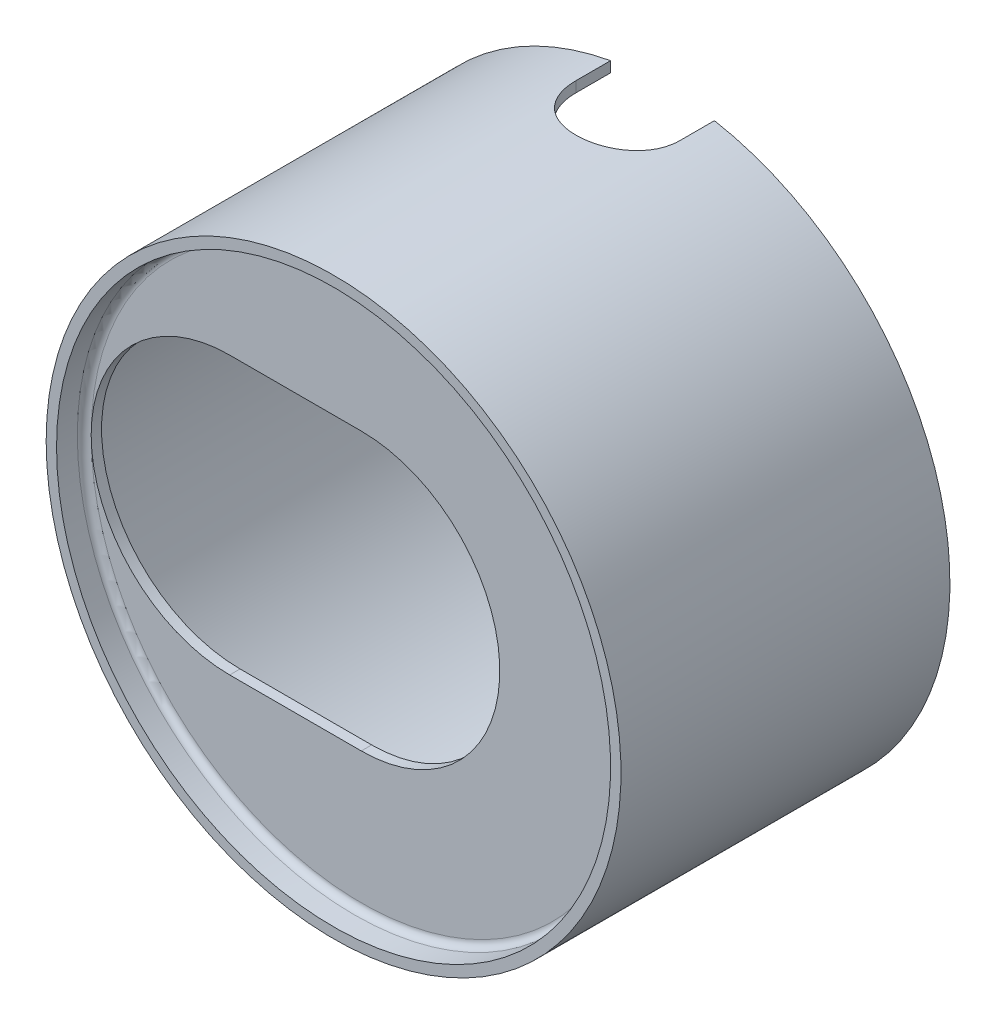
ISO-10303-21;
HEADER;
FILE_DESCRIPTION(('STEP AP214'),'2;1');
FILE_NAME('part.step','',(''),(''),'','','');
FILE_SCHEMA(('AUTOMOTIVE_DESIGN { 1 0 10303 214 1 1 1 1 }'));
ENDSEC;
DATA;
#1=APPLICATION_CONTEXT('core data for automotive mechanical design processes');
#2=APPLICATION_PROTOCOL_DEFINITION('international standard','automotive_design',2000,#1);
#3=PRODUCT_CONTEXT('',#1,'mechanical');
#4=PRODUCT('Part','Part','',(#3));
#5=PRODUCT_RELATED_PRODUCT_CATEGORY('part','',(#4));
#6=PRODUCT_DEFINITION_FORMATION('','',#4);
#7=PRODUCT_DEFINITION_CONTEXT('part definition',#1,'design');
#8=PRODUCT_DEFINITION('design','',#6,#7);
#9=PRODUCT_DEFINITION_SHAPE('','',#8);
#10=(LENGTH_UNIT() NAMED_UNIT(*) SI_UNIT(.MILLI.,.METRE.));
#11=(NAMED_UNIT(*) PLANE_ANGLE_UNIT() SI_UNIT($,.RADIAN.));
#12=(NAMED_UNIT(*) SI_UNIT($,.STERADIAN.) SOLID_ANGLE_UNIT());
#13=UNCERTAINTY_MEASURE_WITH_UNIT(LENGTH_MEASURE(1.E-05),#10,'distance_accuracy_value','');
#14=(GEOMETRIC_REPRESENTATION_CONTEXT(3) GLOBAL_UNCERTAINTY_ASSIGNED_CONTEXT((#13)) GLOBAL_UNIT_ASSIGNED_CONTEXT((#10,
#11,#12)) REPRESENTATION_CONTEXT('',''));
#15=CARTESIAN_POINT('',(0.,0.,0.));
#16=DIRECTION('',(0.,0.,1.));
#17=DIRECTION('',(1.,0.,0.));
#18=AXIS2_PLACEMENT_3D('',#15,#16,#17);
#19=CARTESIAN_POINT('',(12.2749999999999,16.3055768553885,-42.));
#20=DIRECTION('',(0.,0.,-1.));
#21=DIRECTION('',(-1.,0.,0.));
#22=AXIS2_PLACEMENT_3D('',#19,#20,#21);
#23=PLANE('',#22);
#24=CARTESIAN_POINT('',(12.2749999999999,16.3055768553885,-42.));
#25=DIRECTION('',(0.,0.,-1.));
#26=DIRECTION('',(-1.,0.,0.));
#27=AXIS2_PLACEMENT_3D('',#24,#25,#26);
#28=CIRCLE('',#27,41.5);
#29=CARTESIAN_POINT('',(19.7749999999999,57.1222401193056,-42.));
#30=VERTEX_POINT('',#29);
#31=CARTESIAN_POINT('',(4.77499999999991,57.1222401193056,-42.));
#32=VERTEX_POINT('',#31);
#33=EDGE_CURVE('E140',#30,#32,#28,.T.);
#34=ORIENTED_EDGE('',*,*,#33,.T.);
#35=DIRECTION('',(0.,-1.,0.));
#36=VECTOR('',#35,1.);
#37=CARTESIAN_POINT('',(4.7749999999999,57.8055768553885,-42.));
#38=LINE('',#37,#36);
#39=CARTESIAN_POINT('',(4.77499999999991,55.5961609691428,-42.));
#40=VERTEX_POINT('',#39);
#41=EDGE_CURVE('E122',#32,#40,#38,.T.);
#42=ORIENTED_EDGE('',*,*,#41,.T.);
#43=CARTESIAN_POINT('',(12.2749999999999,16.3055768553885,-42.));
#44=DIRECTION('',(0.,0.,-1.));
#45=DIRECTION('',(-1.,0.,0.));
#46=AXIS2_PLACEMENT_3D('',#43,#44,#45);
#47=CIRCLE('',#46,40.);
#48=CARTESIAN_POINT('',(19.7749999999999,55.5961609691428,-42.));
#49=VERTEX_POINT('',#48);
#50=EDGE_CURVE('E145',#49,#40,#47,.T.);
#51=ORIENTED_EDGE('',*,*,#50,.F.);
#52=DIRECTION('',(0.,-1.,0.));
#53=VECTOR('',#52,1.);
#54=CARTESIAN_POINT('',(19.7749999999999,57.8055768553885,-42.));
#55=LINE('',#54,#53);
#56=EDGE_CURVE('E134',#30,#49,#55,.T.);
#57=ORIENTED_EDGE('',*,*,#56,.F.);
#58=EDGE_LOOP('',(#34,#42,#51,#57));
#59=FACE_BOUND('',#58,.T.);
#60=ADVANCED_FACE('F53',(#59),#23,.T.);
#61=CARTESIAN_POINT('',(12.2749999999999,16.3055768553885,5.5));
#62=DIRECTION('',(0.,0.,-1.));
#63=DIRECTION('',(-1.,0.,0.));
#64=AXIS2_PLACEMENT_3D('',#61,#62,#63);
#65=CYLINDRICAL_SURFACE('',#64,40.);
#66=CARTESIAN_POINT('',(12.2749999999999,16.3055768553885,0.));
#67=DIRECTION('',(0.,0.,1.));
#68=DIRECTION('',(1.,0.,0.));
#69=AXIS2_PLACEMENT_3D('',#66,#67,#68);
#70=CIRCLE('',#69,40.);
#71=CARTESIAN_POINT('',(52.2749999999999,16.3055768553885,0.));
#72=VERTEX_POINT('',#71);
#73=EDGE_CURVE('E164',#72,#72,#70,.T.);
#74=ORIENTED_EDGE('',*,*,#73,.T.);
#75=EDGE_LOOP('',(#74));
#76=FACE_BOUND('',#75,.T.);
#77=DIRECTION('',(0.,0.,-1.));
#78=VECTOR('',#77,1.);
#79=CARTESIAN_POINT('',(4.77499999999992,55.5961609691428,5.5));
#80=LINE('',#79,#78);
#81=CARTESIAN_POINT('',(4.77499999999991,55.5961609691428,-37.));
#82=VERTEX_POINT('',#81);
#83=EDGE_CURVE('E128',#82,#40,#80,.T.);
#84=ORIENTED_EDGE('',*,*,#83,.F.);
#85=CARTESIAN_POINT('',(19.7749999999999,55.5961609691428,-37.));
#86=CARTESIAN_POINT('',(19.77502472219,55.5961435299024,-36.7910378883819));
#87=CARTESIAN_POINT('',(19.7662680441367,55.5978273861956,-36.582081848433));
#88=CARTESIAN_POINT('',(19.7313723777491,55.6044711558478,-36.1657017799123));
#89=CARTESIAN_POINT('',(19.7052353762027,55.6094306947549,-35.9582775789721));
#90=CARTESIAN_POINT('',(19.6358088546263,55.6224900612326,-35.5467253124641));
#91=CARTESIAN_POINT('',(19.5925437686087,55.6305854150638,-35.3425929807479));
#92=CARTESIAN_POINT('',(19.4892051193282,55.649674520952,-34.9387682551437));
#93=CARTESIAN_POINT('',(19.4291315215542,55.6606682789599,-34.7390758703727));
#94=CARTESIAN_POINT('',(19.2926346630228,55.6852366107637,-34.3455357208108));
#95=CARTESIAN_POINT('',(19.2162121755592,55.6988110624908,-34.1516876800802));
#96=CARTESIAN_POINT('',(19.0475521478777,55.7281574831553,-33.7710869590074));
#97=CARTESIAN_POINT('',(18.9553087581942,55.743930264476,-33.5843369343259));
#98=CARTESIAN_POINT('',(18.7557239229081,55.7772178625457,-33.219329362258));
#99=CARTESIAN_POINT('',(18.6483872857884,55.7947321239667,-33.0410691342685));
#100=CARTESIAN_POINT('',(18.4193049452444,55.8310239158113,-32.6941029052841));
#101=CARTESIAN_POINT('',(18.2975538691618,55.8498019161325,-32.5254005016129));
#102=CARTESIAN_POINT('',(18.0391363534451,55.888300019577,-32.1969953624548));
#103=CARTESIAN_POINT('',(17.9023246217115,55.9080280373636,-32.0374078665538));
#104=CARTESIAN_POINT('',(17.6157553818787,55.947691550423,-31.7302306737793));
#105=CARTESIAN_POINT('',(17.4659930964162,55.9676271198541,-31.5826454437452));
#106=CARTESIAN_POINT('',(17.1546166654343,56.0071380197698,-31.3005735910992));
#107=CARTESIAN_POINT('',(16.993005037925,56.0267134256901,-31.1660841996544));
#108=CARTESIAN_POINT('',(16.6589340176172,56.0649706395736,-30.9110509837351));
#109=CARTESIAN_POINT('',(16.4864706480463,56.0836521154762,-30.7905123181883));
#110=CARTESIAN_POINT('',(16.130600676929,56.1197271069245,-30.5634462985893));
#111=CARTESIAN_POINT('',(15.9471222294966,56.1371100106855,-30.4570298132303));
#112=CARTESIAN_POINT('',(15.5716725668305,56.1699400755565,-30.2600526199592));
#113=CARTESIAN_POINT('',(15.3797012513797,56.1853872138158,-30.1694920992124));
#114=CARTESIAN_POINT('',(14.9886481500913,56.2139035243658,-30.0049225517462));
#115=CARTESIAN_POINT('',(14.7895673150409,56.2269730132157,-29.9309113213594));
#116=CARTESIAN_POINT('',(14.3856951633498,56.2503621951518,-29.7999980626984));
#117=CARTESIAN_POINT('',(14.1809037872927,56.2606818596152,-29.7430962125148));
#118=CARTESIAN_POINT('',(13.7695097513378,56.2781716402165,-29.6474139320724));
#119=CARTESIAN_POINT('',(13.5629557270573,56.2853769326437,-29.6084307760302));
#120=CARTESIAN_POINT('',(13.1472218128092,56.2966066662658,-29.5479297445057));
#121=CARTESIAN_POINT('',(12.9380419687057,56.30063116294,-29.5264115643996));
#122=CARTESIAN_POINT('',(12.5185865014767,56.3053850379916,-29.5010126779978));
#123=CARTESIAN_POINT('',(12.3083109292776,56.3061145681661,-29.4971311591927));
#124=CARTESIAN_POINT('',(11.8881917456507,56.3042581365561,-29.5070347645988));
#125=CARTESIAN_POINT('',(11.678348131285,56.3016721973967,-29.5208197682521));
#126=CARTESIAN_POINT('',(11.2632821849336,56.2933120912036,-29.5656577083189));
#127=CARTESIAN_POINT('',(11.0580350195901,56.2875788831682,-29.5964888402025));
#128=CARTESIAN_POINT('',(10.6508371562804,56.2731088643529,-29.675035587244));
#129=CARTESIAN_POINT('',(10.4488875381186,56.2643710895788,-29.7227566215518));
#130=CARTESIAN_POINT('',(10.0497942121494,56.2441343949365,-29.8347082671736));
#131=CARTESIAN_POINT('',(9.85264978248871,56.2326358926463,-29.8989363817876));
#132=CARTESIAN_POINT('',(9.46448910519066,56.2071916426446,-30.0434263850498));
#133=CARTESIAN_POINT('',(9.27347294557556,56.1932458598005,-30.1236885038799));
#134=CARTESIAN_POINT('',(8.89777508661311,56.1631994021023,-30.3001734302868));
#135=CARTESIAN_POINT('',(8.71313667705221,56.1470866690866,-30.3964863279548));
#136=CARTESIAN_POINT('',(8.35267725553918,56.1132161828423,-30.6040152620103));
#137=CARTESIAN_POINT('',(8.17685334908685,56.0954589751515,-30.7152263614979));
#138=CARTESIAN_POINT('',(7.83506041716208,56.0587716409084,-30.9518468377783));
#139=CARTESIAN_POINT('',(7.66909534959105,56.039841049442,-31.0772618588909));
#140=CARTESIAN_POINT('',(7.34825302536101,56.0013356563966,-31.3413499255239));
#141=CARTESIAN_POINT('',(7.19337189527612,55.9817610833905,-31.480018299531));
#142=CARTESIAN_POINT('',(6.89333305874859,55.9421877012531,-31.77198341025));
#143=CARTESIAN_POINT('',(6.74836479923098,55.9221870385992,-31.9254746523702));
#144=CARTESIAN_POINT('',(6.47190426735583,55.8826355919661,-32.2441033331971));
#145=CARTESIAN_POINT('',(6.34040715350567,55.8630846483321,-32.409236551533));
#146=CARTESIAN_POINT('',(6.09166431086741,55.8249671302259,-32.7501860904074));
#147=CARTESIAN_POINT('',(5.97442804040419,55.8064012136127,-32.9260093863285));
#148=CARTESIAN_POINT('',(5.7551875880671,55.7708068785722,-33.286966498319));
#149=CARTESIAN_POINT('',(5.65317762475513,55.7537778775531,-33.472096744657));
#150=CARTESIAN_POINT('',(5.46483319778718,55.7217002570905,-33.8509528249041));
#151=CARTESIAN_POINT('',(5.37854121397161,55.7066570337712,-34.0447002418986));
#152=CARTESIAN_POINT('',(5.22265312686164,55.67905361442,-34.438886005378));
#153=CARTESIAN_POINT('',(5.15305053129279,55.6664924531864,-34.6393217153979));
#154=CARTESIAN_POINT('',(5.03110454439945,55.6442324102033,-35.0452988512416));
#155=CARTESIAN_POINT('',(4.97874309847125,55.6345305353883,-35.2508346921201));
#156=CARTESIAN_POINT('',(4.89161556266742,55.6182669156399,-35.6656396988987));
#157=CARTESIAN_POINT('',(4.85684107587722,55.6117036722448,-35.874907033689));
#158=CARTESIAN_POINT('',(4.81233572542244,55.6032740660503,-36.2370839598172));
#159=CARTESIAN_POINT('',(4.79832792771004,55.6006087787316,-36.3894635297809));
#160=CARTESIAN_POINT('',(4.77966545252865,55.5970515219776,-36.6945573290167));
#161=CARTESIAN_POINT('',(4.77499507542518,55.5961565759749,-36.847270563625));
#162=CARTESIAN_POINT('',(4.77499999999991,55.5961609691428,-37.));
#163=B_SPLINE_CURVE_WITH_KNOTS('',3,(#85,#86,#87,#88,#89,#90,#91,#92,#93,#94,#95,#96,#97,#98,
#99,#100,#101,#102,#103,#104,#105,#106,#107,#108,#109,#110,#111,#112,#113,#114,#115,#116,#117,
#118,#119,#120,#121,#122,#123,#124,#125,#126,#127,#128,#129,#130,#131,#132,#133,#134,#135,#136,
#137,#138,#139,#140,#141,#142,#143,#144,#145,#146,#147,#148,#149,#150,#151,#152,#153,#154,#155,
#156,#157,#158,#159,#160,#161,#162),.UNSPECIFIED.,.F.,.F.,(4,2,2,2,2,2,2,2,2,2,2,2,2,2,2,2,2,2,
2,2,2,2,2,2,2,2,2,2,2,2,2,2,2,2,2,2,2,2,4),(0.,0.62668706543285,1.25330250502348,
1.87902725102364,2.50475328177376,3.13044972255887,3.75637800289342,4.38210732173785,
5.00807060576238,5.64071324310006,6.27359026139342,6.90633317960696,7.53930934123083,
8.17699293455791,8.81468405465011,9.45229021054621,10.0899030030143,10.7201128825572,
11.3503117697513,11.9804816237986,12.6106471775366,13.2327996709975,13.8551519642267,
14.4774101818546,15.0996773331774,15.725562665181,16.3512411047692,16.9771690531248,
17.6028771837402,18.2383493548526,18.8735923318228,19.5092543547197,20.1446743989955,
20.7817870594762,21.4186514756736,22.054846842743,22.6907381701373,23.1495928503846,
23.6076753763251),.UNSPECIFIED.);
#164=CARTESIAN_POINT('',(19.7749999999999,55.5961609691428,-37.));
#165=VERTEX_POINT('',#164);
#166=EDGE_CURVE('E204',#165,#82,#163,.T.);
#167=ORIENTED_EDGE('',*,*,#166,.F.);
#168=DIRECTION('',(0.,0.,-1.));
#169=VECTOR('',#168,1.);
#170=CARTESIAN_POINT('',(19.7749999999999,55.5961609691428,5.5));
#171=LINE('',#170,#169);
#172=EDGE_CURVE('E213',#165,#49,#171,.T.);
#173=ORIENTED_EDGE('',*,*,#172,.T.);
#174=ORIENTED_EDGE('',*,*,#50,.T.);
#175=EDGE_LOOP('',(#84,#167,#173,#174));
#176=FACE_BOUND('',#175,.T.);
#177=ADVANCED_FACE('F223',(#76,#176),#65,.F.);
#178=CARTESIAN_POINT('',(12.2749999999999,16.3055768553885,1.5));
#179=DIRECTION('',(0.,0.,-1.));
#180=DIRECTION('',(-1.,0.,0.));
#181=AXIS2_PLACEMENT_3D('',#178,#179,#180);
#182=CYLINDRICAL_SURFACE('',#181,41.5);
#183=CARTESIAN_POINT('',(12.2749999999999,16.3055768553885,5.5));
#184=DIRECTION('',(0.,0.,-1.));
#185=DIRECTION('',(-1.,0.,0.));
#186=AXIS2_PLACEMENT_3D('',#183,#184,#185);
#187=CIRCLE('',#186,41.5);
#188=CARTESIAN_POINT('',(-29.2250000000001,16.3055768553885,5.5));
#189=VERTEX_POINT('',#188);
#190=EDGE_CURVE('E150',#189,#189,#187,.T.);
#191=ORIENTED_EDGE('',*,*,#190,.T.);
#192=EDGE_LOOP('',(#191));
#193=FACE_BOUND('',#192,.T.);
#194=DIRECTION('',(0.,0.,-1.));
#195=VECTOR('',#194,1.);
#196=CARTESIAN_POINT('',(4.77499999999992,57.1222401193056,1.5));
#197=LINE('',#196,#195);
#198=CARTESIAN_POINT('',(4.77499999999991,57.1222401193056,-37.));
#199=VERTEX_POINT('',#198);
#200=EDGE_CURVE('E11',#32,#199,#197,.F.);
#201=ORIENTED_EDGE('',*,*,#200,.F.);
#202=ORIENTED_EDGE('',*,*,#33,.F.);
#203=DIRECTION('',(0.,0.,-1.));
#204=VECTOR('',#203,1.);
#205=CARTESIAN_POINT('',(19.7749999999999,57.1222401193056,1.5));
#206=LINE('',#205,#204);
#207=CARTESIAN_POINT('',(19.7749999999999,57.1222401193056,-37.));
#208=VERTEX_POINT('',#207);
#209=EDGE_CURVE('E62',#30,#208,#206,.F.);
#210=ORIENTED_EDGE('',*,*,#209,.T.);
#211=CARTESIAN_POINT('',(4.77499999999991,57.1222401193056,-37.));
#212=CARTESIAN_POINT('',(4.77497542227476,57.1222233535428,-36.7908968167383));
#213=CARTESIAN_POINT('',(4.78374376011938,57.1238463992347,-36.5817995010567));
#214=CARTESIAN_POINT('',(4.8186869594208,57.1302505012438,-36.1651352060899));
#215=CARTESIAN_POINT('',(4.84485991523767,57.1350312118263,-35.957568061781));
#216=CARTESIAN_POINT('',(4.91438543468207,57.1476204470655,-35.5457187211026));
#217=CARTESIAN_POINT('',(4.95771440165108,57.1554248126219,-35.3414324121312));
#218=CARTESIAN_POINT('',(5.0612094981855,57.17382865207,-34.937300683807));
#219=CARTESIAN_POINT('',(5.12137564483849,57.1844281287984,-34.7374552689613));
#220=CARTESIAN_POINT('',(5.25808943582423,57.2081167421949,-34.34360784389));
#221=CARTESIAN_POINT('',(5.33463669858185,57.2212058208704,-34.1496056976736));
#222=CARTESIAN_POINT('',(5.50357808195591,57.2495041194543,-33.7687048905423));
#223=CARTESIAN_POINT('',(5.59597806246582,57.2647141229635,-33.5818088877048));
#224=CARTESIAN_POINT('',(5.79590562743697,57.2968146642896,-33.2165263620844));
#225=CARTESIAN_POINT('',(5.90342813023357,57.3137046370257,-33.0381370076419));
#226=CARTESIAN_POINT('',(6.13291113610828,57.3487031473116,-32.6909322678557));
#227=CARTESIAN_POINT('',(6.25487701799234,57.3668121377409,-32.5221204840951));
#228=CARTESIAN_POINT('',(6.51365047923435,57.4039235291304,-32.1936504210732));
#229=CARTESIAN_POINT('',(6.65059283968997,57.4229329914747,-32.0340991078902));
#230=CARTESIAN_POINT('',(6.93742449166713,57.4611502646471,-31.7270075935749));
#231=CARTESIAN_POINT('',(7.08731856000978,57.4803581463364,-31.5794718633104));
#232=CARTESIAN_POINT('',(7.39895528333698,57.5184245863269,-31.2975152423995));
#233=CARTESIAN_POINT('',(7.56069541475251,57.5372832179626,-31.1630915726341));
#234=CARTESIAN_POINT('',(7.89501552913071,57.5741365927796,-30.9082074683438));
#235=CARTESIAN_POINT('',(8.06759948628024,57.592131014921,-30.7877521997082));
#236=CARTESIAN_POINT('',(8.42359857601547,57.6268656209524,-30.560935085634));
#237=CARTESIAN_POINT('',(8.60708000249815,57.6435963337708,-30.4546758013966));
#238=CARTESIAN_POINT('',(8.98250970893799,57.6751911759309,-30.2580111288042));
#239=CARTESIAN_POINT('',(9.17445809426237,57.6900552820348,-30.1676059378155));
#240=CARTESIAN_POINT('',(9.56543926936219,57.7174915109022,-30.0033410448618));
#241=CARTESIAN_POINT('',(9.76447113619474,57.7300639309638,-29.9294791964606));
#242=CARTESIAN_POINT('',(10.1682198878687,57.7525592842259,-29.7988545441037));
#243=CARTESIAN_POINT('',(10.3729368372007,57.7624821873572,-29.7420919342056));
#244=CARTESIAN_POINT('',(10.7843272110727,57.7793012556669,-29.6466333776455));
#245=CARTESIAN_POINT('',(10.9909555962969,57.7862289659619,-29.6077488494526));
#246=CARTESIAN_POINT('',(11.4068239481355,57.7970161196322,-29.5474558636234));
#247=CARTESIAN_POINT('',(11.6160638714218,57.800875613844,-29.5260471164357));
#248=CARTESIAN_POINT('',(12.0356282465461,57.8054167675243,-29.5008756130379));
#249=CARTESIAN_POINT('',(12.2459526534241,57.806098557689,-29.4971121310939));
#250=CARTESIAN_POINT('',(12.6661599301283,57.8042652365392,-29.5072593566749));
#251=CARTESIAN_POINT('',(12.8760428027394,57.8017501454491,-29.5211699523889));
#252=CARTESIAN_POINT('',(13.2913652162331,57.7936430166044,-29.5662850788781));
#253=CARTESIAN_POINT('',(13.4968279492968,57.7880877284479,-29.597283090605));
#254=CARTESIAN_POINT('',(13.9044447046056,57.7740770928558,-29.6762019021885));
#255=CARTESIAN_POINT('',(14.1065976421597,57.7656208138751,-29.7241281380603));
#256=CARTESIAN_POINT('',(14.50608215565,57.7460433469446,-29.8365286337498));
#257=CARTESIAN_POINT('',(14.7034144584548,57.7349225635233,-29.9010003817116));
#258=CARTESIAN_POINT('',(15.0919312417004,57.7103204371549,-30.0460160032017));
#259=CARTESIAN_POINT('',(15.2831156396528,57.6968390625507,-30.1265600922736));
#260=CARTESIAN_POINT('',(15.6590604389005,57.667804520748,-30.3036172757161));
#261=CARTESIAN_POINT('',(15.8437800267985,57.6522404346773,-30.400215228594));
#262=CARTESIAN_POINT('',(16.2043766805208,57.619530537245,-30.6083396633107));
#263=CARTESIAN_POINT('',(16.3802566600169,57.6023852524241,-30.7198611811276));
#264=CARTESIAN_POINT('',(16.7221301443479,57.5669702316861,-30.9571245790327));
#265=CARTESIAN_POINT('',(16.8881197388399,57.5487000567524,-31.0828720273888));
#266=CARTESIAN_POINT('',(17.2089746735371,57.5115469679096,-31.3476427513116));
#267=CARTESIAN_POINT('',(17.3638439143047,57.4926642722547,-31.4866613316602));
#268=CARTESIAN_POINT('',(17.6636554683788,57.4545205038013,-31.7791868263386));
#269=CARTESIAN_POINT('',(17.8084209810464,57.4352579181367,-31.9328748095486));
#270=CARTESIAN_POINT('',(18.0844585826277,57.397176998935,-32.2518777045544));
#271=CARTESIAN_POINT('',(18.2157355282672,57.3783585073895,-32.4171883950851));
#272=CARTESIAN_POINT('',(18.4640205415001,57.3416803358988,-32.7584692664488));
#273=CARTESIAN_POINT('',(18.5810191238441,57.3238212976888,-32.9344464182035));
#274=CARTESIAN_POINT('',(18.7997683659783,57.2895939208798,-33.2956827722022));
#275=CARTESIAN_POINT('',(18.9015248025773,57.2732250184431,-33.4809384221709));
#276=CARTESIAN_POINT('',(19.0893289889218,57.2424062832381,-33.8599738308099));
#277=CARTESIAN_POINT('',(19.1753375455149,57.2279612622967,-34.0537734066909));
#278=CARTESIAN_POINT('',(19.3306573189196,57.201467957971,-34.4480262193454));
#279=CARTESIAN_POINT('',(19.3999750127519,57.1894187451918,-34.6484768406585));
#280=CARTESIAN_POINT('',(19.5213551206758,57.1680796556735,-35.0544462180976));
#281=CARTESIAN_POINT('',(19.5734356248698,57.1587868871688,-35.2599594161298));
#282=CARTESIAN_POINT('',(19.6600106465834,57.1432255876039,-35.6746848765426));
#283=CARTESIAN_POINT('',(19.6945135719774,57.1369556107306,-35.8838953207767));
#284=CARTESIAN_POINT('',(19.7383920296529,57.1289540772979,-36.2445375266753));
#285=CARTESIAN_POINT('',(19.7521269782315,57.1264382421883,-36.3954362273637));
#286=CARTESIAN_POINT('',(19.7704255578466,57.1230806578514,-36.6975518835671));
#287=CARTESIAN_POINT('',(19.7750045986952,57.1222360958199,-36.8487678748278));
#288=CARTESIAN_POINT('',(19.7749999999999,57.1222401193056,-37.));
#289=B_SPLINE_CURVE_WITH_KNOTS('',3,(#211,#212,#213,#214,#215,#216,#217,#218,#219,#220,#221,
#222,#223,#224,#225,#226,#227,#228,#229,#230,#231,#232,#233,#234,#235,#236,#237,#238,#239,#240,
#241,#242,#243,#244,#245,#246,#247,#248,#249,#250,#251,#252,#253,#254,#255,#256,#257,#258,#259,
#260,#261,#262,#263,#264,#265,#266,#267,#268,#269,#270,#271,#272,#273,#274,#275,#276,#277,#278,
#279,#280,#281,#282,#283,#284,#285,#286,#287,#288),.UNSPECIFIED.,.F.,.F.,(4,2,2,2,2,2,2,2,2,2,2,
2,2,2,2,2,2,2,2,2,2,2,2,2,2,2,2,2,2,2,2,2,2,2,2,2,2,2,4),(0.,0.627110727076293,1.25415280280332,
1.88033541391612,2.50651866052623,3.1326873226632,3.75908794619712,4.38527857921782,
5.01170314732047,5.64431934767616,6.27716987231407,6.90988597063329,7.54283532307967,
8.18013521863398,8.817443047316,9.45466813975297,10.0919004637224,10.7222475621662,
11.3525842163477,11.9828949451163,12.613201686388,13.2360524345433,13.8591033755244,
14.4820597839653,15.1050245473371,15.7313935423518,16.357554703899,16.9839618089898,
17.6101481119541,18.245427096216,18.8804765328691,19.5159455684956,20.1511731471481,
20.7879607988462,21.4245009403845,22.0603709110772,22.6959364401565,23.1502948191237,
23.6038878462798),.UNSPECIFIED.);
#290=EDGE_CURVE('E141',#199,#208,#289,.T.);
#291=ORIENTED_EDGE('',*,*,#290,.F.);
#292=EDGE_LOOP('',(#201,#202,#210,#291));
#293=FACE_BOUND('',#292,.T.);
#294=ADVANCED_FACE('F138',(#193,#293),#182,.T.);
#295=CARTESIAN_POINT('',(0.,0.,1.5));
#296=DIRECTION('',(0.,0.,1.));
#297=DIRECTION('',(1.,0.,0.));
#298=AXIS2_PLACEMENT_3D('',#295,#296,#297);
#299=PLANE('',#298);
#300=DIRECTION('',(1.,0.,0.));
#301=VECTOR('',#300,1.);
#302=CARTESIAN_POINT('',(12.2749999999999,-3.69442314461149,1.5));
#303=LINE('',#302,#301);
#304=CARTESIAN_POINT('',(-6.72500000000007,-3.6944231446115,1.5));
#305=VERTEX_POINT('',#304);
#306=CARTESIAN_POINT('',(12.2749999999999,-3.69442314461149,1.5));
#307=VERTEX_POINT('',#306);
#308=EDGE_CURVE('E267',#305,#307,#303,.T.);
#309=ORIENTED_EDGE('',*,*,#308,.F.);
#310=CARTESIAN_POINT('',(-6.72500000000007,16.3055768553885,1.5));
#311=DIRECTION('',(0.,0.,1.));
#312=DIRECTION('',(1.,0.,0.));
#313=AXIS2_PLACEMENT_3D('',#310,#311,#312);
#314=CIRCLE('',#313,20.);
#315=CARTESIAN_POINT('',(-26.7250000000001,16.3055768553885,1.5));
#316=VERTEX_POINT('',#315);
#317=EDGE_CURVE('E258',#316,#305,#314,.T.);
#318=ORIENTED_EDGE('',*,*,#317,.F.);
#319=CARTESIAN_POINT('',(12.2749999999999,16.3055768553885,1.5));
#320=DIRECTION('',(0.,0.,1.));
#321=DIRECTION('',(1.,0.,0.));
#322=AXIS2_PLACEMENT_3D('',#319,#320,#321);
#323=CIRCLE('',#322,39.);
#324=EDGE_CURVE('E171',#316,#316,#323,.T.);
#325=ORIENTED_EDGE('',*,*,#324,.T.);
#326=CARTESIAN_POINT('',(-6.72500000000007,36.3055768553885,1.5));
#327=VERTEX_POINT('',#326);
#328=EDGE_CURVE('E263',#327,#316,#314,.T.);
#329=ORIENTED_EDGE('',*,*,#328,.F.);
#330=DIRECTION('',(-1.,0.,0.));
#331=VECTOR('',#330,1.);
#332=CARTESIAN_POINT('',(12.2749999999999,36.3055768553885,1.5));
#333=LINE('',#332,#331);
#334=CARTESIAN_POINT('',(12.2749999999999,36.3055768553885,1.5));
#335=VERTEX_POINT('',#334);
#336=EDGE_CURVE('E255',#335,#327,#333,.T.);
#337=ORIENTED_EDGE('',*,*,#336,.F.);
#338=CARTESIAN_POINT('',(12.2749999999999,16.3055768553885,1.5));
#339=DIRECTION('',(0.,0.,1.));
#340=DIRECTION('',(1.,0.,0.));
#341=AXIS2_PLACEMENT_3D('',#338,#339,#340);
#342=CIRCLE('',#341,20.);
#343=EDGE_CURVE('E160',#307,#335,#342,.T.);
#344=ORIENTED_EDGE('',*,*,#343,.F.);
#345=EDGE_LOOP('',(#309,#318,#325,#329,#337,#344));
#346=FACE_BOUND('',#345,.T.);
#347=ADVANCED_FACE('F229',(#346),#299,.T.);
#348=CARTESIAN_POINT('',(0.,0.,0.));
#349=DIRECTION('',(0.,0.,1.));
#350=DIRECTION('',(1.,0.,0.));
#351=AXIS2_PLACEMENT_3D('',#348,#349,#350);
#352=PLANE('',#351);
#353=CARTESIAN_POINT('',(-6.72500000000007,16.3055768553885,0.));
#354=DIRECTION('',(0.,0.,1.));
#355=DIRECTION('',(1.,0.,0.));
#356=AXIS2_PLACEMENT_3D('',#353,#354,#355);
#357=CIRCLE('',#356,20.);
#358=CARTESIAN_POINT('',(-6.72500000000007,36.3055768553885,0.));
#359=VERTEX_POINT('',#358);
#360=CARTESIAN_POINT('',(-6.72500000000007,-3.6944231446115,0.));
#361=VERTEX_POINT('',#360);
#362=EDGE_CURVE('E274',#359,#361,#357,.T.);
#363=ORIENTED_EDGE('',*,*,#362,.T.);
#364=DIRECTION('',(1.,0.,0.));
#365=VECTOR('',#364,1.);
#366=CARTESIAN_POINT('',(0.,-3.6944231446115,0.));
#367=LINE('',#366,#365);
#368=CARTESIAN_POINT('',(12.2749999999999,-3.69442314461149,0.));
#369=VERTEX_POINT('',#368);
#370=EDGE_CURVE('E152',#361,#369,#367,.T.);
#371=ORIENTED_EDGE('',*,*,#370,.T.);
#372=CARTESIAN_POINT('',(12.2749999999999,16.3055768553885,0.));
#373=DIRECTION('',(0.,0.,1.));
#374=DIRECTION('',(1.,0.,0.));
#375=AXIS2_PLACEMENT_3D('',#372,#373,#374);
#376=CIRCLE('',#375,20.);
#377=CARTESIAN_POINT('',(12.2749999999999,36.3055768553885,0.));
#378=VERTEX_POINT('',#377);
#379=EDGE_CURVE('E159',#369,#378,#376,.T.);
#380=ORIENTED_EDGE('',*,*,#379,.T.);
#381=DIRECTION('',(-1.,0.,0.));
#382=VECTOR('',#381,1.);
#383=CARTESIAN_POINT('',(0.,36.3055768553885,0.));
#384=LINE('',#383,#382);
#385=EDGE_CURVE('E77',#378,#359,#384,.T.);
#386=ORIENTED_EDGE('',*,*,#385,.T.);
#387=EDGE_LOOP('',(#363,#371,#380,#386));
#388=FACE_BOUND('',#387,.T.);
#389=ORIENTED_EDGE('',*,*,#73,.F.);
#390=EDGE_LOOP('',(#389));
#391=FACE_BOUND('',#390,.T.);
#392=ADVANCED_FACE('F231',(#388,#391),#352,.F.);
#393=CARTESIAN_POINT('',(12.2749999999999,16.3055768553885,1.5));
#394=DIRECTION('',(0.,0.,-1.));
#395=DIRECTION('',(-1.,0.,0.));
#396=AXIS2_PLACEMENT_3D('',#393,#394,#395);
#397=CYLINDRICAL_SURFACE('',#396,20.);
#398=DIRECTION('',(0.,0.,-1.));
#399=VECTOR('',#398,1.);
#400=CARTESIAN_POINT('',(12.2749999999999,-3.69442314461149,1.5));
#401=LINE('',#400,#399);
#402=EDGE_CURVE('E182',#307,#369,#401,.T.);
#403=ORIENTED_EDGE('',*,*,#402,.F.);
#404=ORIENTED_EDGE('',*,*,#343,.T.);
#405=DIRECTION('',(0.,0.,-1.));
#406=VECTOR('',#405,1.);
#407=CARTESIAN_POINT('',(12.2749999999999,36.3055768553885,1.5));
#408=LINE('',#407,#406);
#409=EDGE_CURVE('E179',#335,#378,#408,.T.);
#410=ORIENTED_EDGE('',*,*,#409,.T.);
#411=ORIENTED_EDGE('',*,*,#379,.F.);
#412=EDGE_LOOP('',(#403,#404,#410,#411));
#413=FACE_BOUND('',#412,.T.);
#414=ADVANCED_FACE('F227',(#413),#397,.F.);
#415=CARTESIAN_POINT('',(12.2749999999999,16.3055768553885,5.5));
#416=DIRECTION('',(0.,0.,-1.));
#417=DIRECTION('',(-1.,0.,0.));
#418=AXIS2_PLACEMENT_3D('',#415,#416,#417);
#419=PLANE('',#418);
#420=CARTESIAN_POINT('',(12.2749999999999,16.3055768553885,5.5));
#421=DIRECTION('',(0.,0.,-1.));
#422=DIRECTION('',(-1.,0.,0.));
#423=AXIS2_PLACEMENT_3D('',#420,#421,#422);
#424=CIRCLE('',#423,40.);
#425=CARTESIAN_POINT('',(-27.7250000000001,16.3055768553885,5.5));
#426=VERTEX_POINT('',#425);
#427=EDGE_CURVE('E144',#426,#426,#424,.T.);
#428=ORIENTED_EDGE('',*,*,#427,.T.);
#429=EDGE_LOOP('',(#428));
#430=FACE_BOUND('',#429,.T.);
#431=ORIENTED_EDGE('',*,*,#190,.F.);
#432=EDGE_LOOP('',(#431));
#433=FACE_BOUND('',#432,.T.);
#434=ADVANCED_FACE('F221',(#430,#433),#419,.F.);
#435=CARTESIAN_POINT('',(12.2749999999999,16.3055768553885,2.5));
#436=DIRECTION('',(0.,0.,1.));
#437=DIRECTION('',(1.,0.,0.));
#438=AXIS2_PLACEMENT_3D('',#435,#436,#437);
#439=CIRCLE('',#438,40.);
#440=CARTESIAN_POINT('',(52.2749999999999,16.3055768553885,2.5));
#441=VERTEX_POINT('',#440);
#442=EDGE_CURVE('E175',#441,#441,#439,.F.);
#443=ORIENTED_EDGE('',*,*,#442,.T.);
#444=EDGE_LOOP('',(#443));
#445=FACE_BOUND('',#444,.T.);
#446=ORIENTED_EDGE('',*,*,#427,.F.);
#447=EDGE_LOOP('',(#446));
#448=FACE_BOUND('',#447,.T.);
#449=ADVANCED_FACE('F216',(#445,#448),#65,.F.);
#450=CARTESIAN_POINT('',(12.2749999999999,16.3055768553885,2.5));
#451=DIRECTION('',(0.,0.,1.));
#452=DIRECTION('',(1.,0.,0.));
#453=AXIS2_PLACEMENT_3D('',#450,#451,#452);
#454=TOROIDAL_SURFACE('',#453,39.,1.);
#455=ORIENTED_EDGE('',*,*,#442,.F.);
#456=EDGE_LOOP('',(#455));
#457=FACE_BOUND('',#456,.T.);
#458=ORIENTED_EDGE('',*,*,#324,.F.);
#459=EDGE_LOOP('',(#458));
#460=FACE_BOUND('',#459,.T.);
#461=ADVANCED_FACE('F55',(#457,#460),#454,.F.);
#462=CARTESIAN_POINT('',(12.2749999999999,-3.69442314461149,-0.5));
#463=DIRECTION('',(0.,-1.,0.));
#464=DIRECTION('',(1.,0.,0.));
#465=AXIS2_PLACEMENT_3D('',#462,#463,#464);
#466=PLANE('',#465);
#467=DIRECTION('',(0.,0.,1.));
#468=VECTOR('',#467,1.);
#469=CARTESIAN_POINT('',(-6.72500000000007,-3.6944231446115,-0.5));
#470=LINE('',#469,#468);
#471=EDGE_CURVE('E271',#361,#305,#470,.T.);
#472=ORIENTED_EDGE('',*,*,#471,.T.);
#473=ORIENTED_EDGE('',*,*,#308,.T.);
#474=ORIENTED_EDGE('',*,*,#402,.T.);
#475=ORIENTED_EDGE('',*,*,#370,.F.);
#476=EDGE_LOOP('',(#472,#473,#474,#475));
#477=FACE_BOUND('',#476,.T.);
#478=ADVANCED_FACE('F293',(#477),#466,.F.);
#479=CARTESIAN_POINT('',(12.2749999999999,36.3055768553885,-0.5));
#480=DIRECTION('',(0.,1.,0.));
#481=DIRECTION('',(0.,0.,1.));
#482=AXIS2_PLACEMENT_3D('',#479,#480,#481);
#483=PLANE('',#482);
#484=ORIENTED_EDGE('',*,*,#409,.F.);
#485=ORIENTED_EDGE('',*,*,#336,.T.);
#486=DIRECTION('',(0.,0.,1.));
#487=VECTOR('',#486,1.);
#488=CARTESIAN_POINT('',(-6.72500000000007,36.3055768553885,-0.5));
#489=LINE('',#488,#487);
#490=EDGE_CURVE('E270',#359,#327,#489,.T.);
#491=ORIENTED_EDGE('',*,*,#490,.F.);
#492=ORIENTED_EDGE('',*,*,#385,.F.);
#493=EDGE_LOOP('',(#484,#485,#491,#492));
#494=FACE_BOUND('',#493,.T.);
#495=ADVANCED_FACE('F287',(#494),#483,.F.);
#496=CARTESIAN_POINT('',(-6.72500000000007,16.3055768553885,-0.5));
#497=DIRECTION('',(0.,0.,1.));
#498=DIRECTION('',(1.,0.,0.));
#499=AXIS2_PLACEMENT_3D('',#496,#497,#498);
#500=CYLINDRICAL_SURFACE('',#499,20.);
#501=ORIENTED_EDGE('',*,*,#490,.T.);
#502=ORIENTED_EDGE('',*,*,#328,.T.);
#503=ORIENTED_EDGE('',*,*,#317,.T.);
#504=ORIENTED_EDGE('',*,*,#471,.F.);
#505=ORIENTED_EDGE('',*,*,#362,.F.);
#506=EDGE_LOOP('',(#501,#502,#503,#504,#505));
#507=FACE_BOUND('',#506,.T.);
#508=ADVANCED_FACE('F292',(#507),#500,.F.);
#509=CARTESIAN_POINT('',(4.77499999999992,57.8055768553885,0.));
#510=DIRECTION('',(1.,0.,0.));
#511=DIRECTION('',(0.,0.,-1.));
#512=AXIS2_PLACEMENT_3D('',#509,#510,#511);
#513=PLANE('',#512);
#514=ORIENTED_EDGE('',*,*,#83,.T.);
#515=ORIENTED_EDGE('',*,*,#41,.F.);
#516=ORIENTED_EDGE('',*,*,#200,.T.);
#517=DIRECTION('',(0.,-1.,0.));
#518=VECTOR('',#517,1.);
#519=CARTESIAN_POINT('',(4.77499999999991,57.8055768553885,-37.));
#520=LINE('',#519,#518);
#521=EDGE_CURVE('E464',#199,#82,#520,.T.);
#522=ORIENTED_EDGE('',*,*,#521,.T.);
#523=EDGE_LOOP('',(#514,#515,#516,#522));
#524=FACE_BOUND('',#523,.T.);
#525=ADVANCED_FACE('F124',(#524),#513,.T.);
#526=CARTESIAN_POINT('',(12.2749999999999,57.8055768553885,-37.));
#527=DIRECTION('',(0.,-1.,0.));
#528=DIRECTION('',(0.,0.,-1.));
#529=AXIS2_PLACEMENT_3D('',#526,#527,#528);
#530=CYLINDRICAL_SURFACE('',#529,7.50000000000001);
#531=ORIENTED_EDGE('',*,*,#166,.T.);
#532=ORIENTED_EDGE('',*,*,#521,.F.);
#533=ORIENTED_EDGE('',*,*,#290,.T.);
#534=DIRECTION('',(0.,-1.,0.));
#535=VECTOR('',#534,1.);
#536=CARTESIAN_POINT('',(19.7749999999999,57.8055768553885,-37.));
#537=LINE('',#536,#535);
#538=EDGE_CURVE('E69',#208,#165,#537,.T.);
#539=ORIENTED_EDGE('',*,*,#538,.T.);
#540=EDGE_LOOP('',(#531,#532,#533,#539));
#541=FACE_BOUND('',#540,.T.);
#542=ADVANCED_FACE('F194',(#541),#530,.F.);
#543=CARTESIAN_POINT('',(19.7749999999999,57.8055768553885,0.));
#544=DIRECTION('',(1.,0.,0.));
#545=DIRECTION('',(0.,0.,-1.));
#546=AXIS2_PLACEMENT_3D('',#543,#544,#545);
#547=PLANE('',#546);
#548=ORIENTED_EDGE('',*,*,#538,.F.);
#549=ORIENTED_EDGE('',*,*,#209,.F.);
#550=ORIENTED_EDGE('',*,*,#56,.T.);
#551=ORIENTED_EDGE('',*,*,#172,.F.);
#552=EDGE_LOOP('',(#548,#549,#550,#551));
#553=FACE_BOUND('',#552,.T.);
#554=ADVANCED_FACE('F199',(#553),#547,.F.);
#555=CLOSED_SHELL('',(#60,#177,#294,#347,#392,#414,#434,#449,#461,#478,#495,#508,#525,#542,#554));
#556=MANIFOLD_SOLID_BREP('B2',#555);
#557=ADVANCED_BREP_SHAPE_REPRESENTATION('',(#18,#556),#14);
#558=SHAPE_DEFINITION_REPRESENTATION(#9,#557);
ENDSEC;
END-ISO-10303-21;
